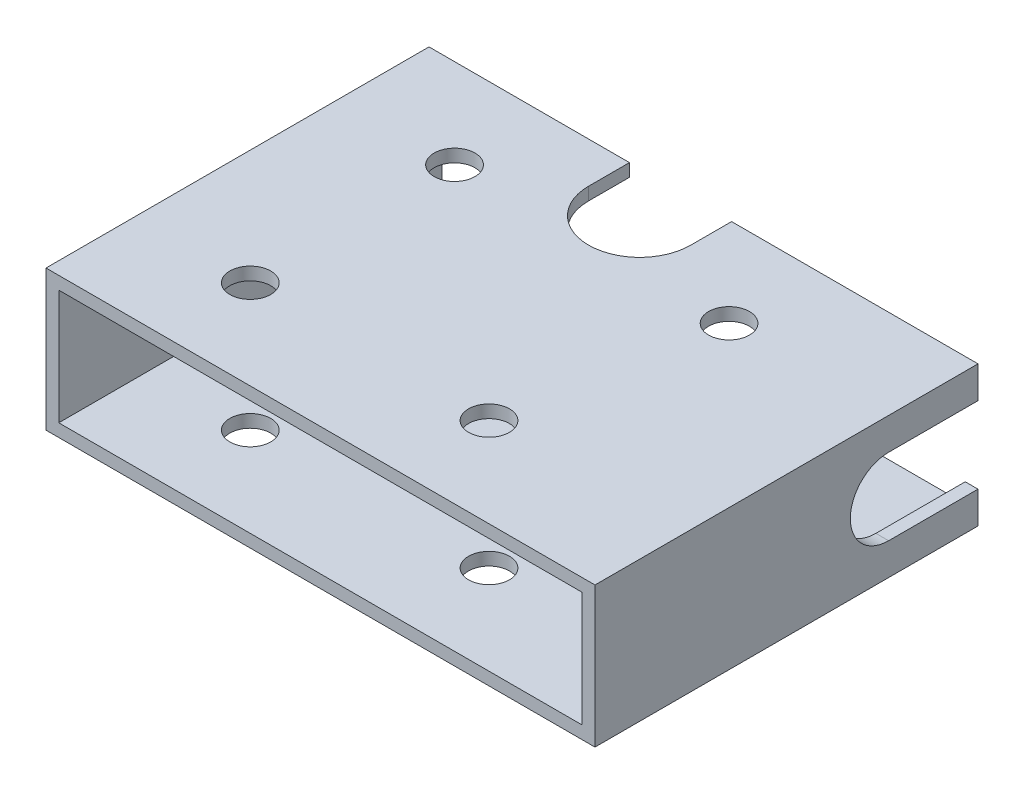
ISO-10303-21;
HEADER;
FILE_DESCRIPTION(('STEP AP214'),'2;1');
FILE_NAME('part.step','',(''),(''),'','','');
FILE_SCHEMA(('AUTOMOTIVE_DESIGN { 1 0 10303 214 1 1 1 1 }'));
ENDSEC;
DATA;
#1=APPLICATION_CONTEXT('core data for automotive mechanical design processes');
#2=APPLICATION_PROTOCOL_DEFINITION('international standard','automotive_design',2000,#1);
#3=PRODUCT_CONTEXT('',#1,'mechanical');
#4=PRODUCT('Part','Part','',(#3));
#5=PRODUCT_RELATED_PRODUCT_CATEGORY('part','',(#4));
#6=PRODUCT_DEFINITION_FORMATION('','',#4);
#7=PRODUCT_DEFINITION_CONTEXT('part definition',#1,'design');
#8=PRODUCT_DEFINITION('design','',#6,#7);
#9=PRODUCT_DEFINITION_SHAPE('','',#8);
#10=(LENGTH_UNIT() NAMED_UNIT(*) SI_UNIT(.MILLI.,.METRE.));
#11=(NAMED_UNIT(*) PLANE_ANGLE_UNIT() SI_UNIT($,.RADIAN.));
#12=(NAMED_UNIT(*) SI_UNIT($,.STERADIAN.) SOLID_ANGLE_UNIT());
#13=UNCERTAINTY_MEASURE_WITH_UNIT(LENGTH_MEASURE(1.E-05),#10,'distance_accuracy_value','');
#14=(GEOMETRIC_REPRESENTATION_CONTEXT(3) GLOBAL_UNCERTAINTY_ASSIGNED_CONTEXT((#13)) GLOBAL_UNIT_ASSIGNED_CONTEXT((#10,
#11,#12)) REPRESENTATION_CONTEXT('',''));
#15=CARTESIAN_POINT('',(0.,0.,0.));
#16=DIRECTION('',(0.,0.,1.));
#17=DIRECTION('',(1.,0.,0.));
#18=AXIS2_PLACEMENT_3D('',#15,#16,#17);
#19=CARTESIAN_POINT('',(0.,0.,0.));
#20=DIRECTION('',(0.,0.,-1.));
#21=DIRECTION('',(-1.,0.,0.));
#22=AXIS2_PLACEMENT_3D('',#19,#20,#21);
#23=PLANE('',#22);
#24=DIRECTION('',(1.,0.,0.));
#25=VECTOR('',#24,1.);
#26=CARTESIAN_POINT('',(-3.,8.5,0.));
#27=LINE('',#26,#25);
#28=CARTESIAN_POINT('',(-1.,8.5,0.));
#29=VERTEX_POINT('',#28);
#30=CARTESIAN_POINT('',(0.,8.5,0.));
#31=VERTEX_POINT('',#30);
#32=EDGE_CURVE('E206',#29,#31,#27,.T.);
#33=ORIENTED_EDGE('',*,*,#32,.F.);
#34=DIRECTION('',(0.,1.,0.));
#35=VECTOR('',#34,1.);
#36=CARTESIAN_POINT('',(-1.,0.999999999999997,0.));
#37=LINE('',#36,#35);
#38=CARTESIAN_POINT('',(-1.,10.,0.));
#39=VERTEX_POINT('',#38);
#40=EDGE_CURVE('E321',#29,#39,#37,.T.);
#41=ORIENTED_EDGE('',*,*,#40,.T.);
#42=DIRECTION('',(-1.,0.,0.));
#43=VECTOR('',#42,1.);
#44=CARTESIAN_POINT('',(-1.,10.,0.));
#45=LINE('',#44,#43);
#46=CARTESIAN_POINT('',(-19.3,10.,0.));
#47=VERTEX_POINT('',#46);
#48=EDGE_CURVE('E342',#39,#47,#45,.T.);
#49=ORIENTED_EDGE('',*,*,#48,.T.);
#50=DIRECTION('',(0.,1.,0.));
#51=VECTOR('',#50,1.);
#52=CARTESIAN_POINT('',(-19.3,8.,0.));
#53=LINE('',#52,#51);
#54=CARTESIAN_POINT('',(-19.3,11.,0.));
#55=VERTEX_POINT('',#54);
#56=EDGE_CURVE('E257',#47,#55,#53,.T.);
#57=ORIENTED_EDGE('',*,*,#56,.T.);
#58=DIRECTION('',(-1.,0.,0.));
#59=VECTOR('',#58,1.);
#60=CARTESIAN_POINT('',(-43.,11.,0.));
#61=LINE('',#60,#59);
#62=CARTESIAN_POINT('',(0.,11.,0.));
#63=VERTEX_POINT('',#62);
#64=EDGE_CURVE('E386',#63,#55,#61,.T.);
#65=ORIENTED_EDGE('',*,*,#64,.F.);
#66=DIRECTION('',(0.,1.,0.));
#67=VECTOR('',#66,1.);
#68=CARTESIAN_POINT('',(0.,11.,0.));
#69=LINE('',#68,#67);
#70=EDGE_CURVE('E368',#31,#63,#69,.T.);
#71=ORIENTED_EDGE('',*,*,#70,.F.);
#72=EDGE_LOOP('',(#33,#41,#49,#57,#65,#71));
#73=FACE_BOUND('',#72,.T.);
#74=ADVANCED_FACE('F38',(#73),#23,.T.);
#75=DIRECTION('',(0.,1.,0.));
#76=VECTOR('',#75,1.);
#77=CARTESIAN_POINT('',(-28.3,-2.,0.));
#78=LINE('',#77,#76);
#79=CARTESIAN_POINT('',(-28.3,0.,0.));
#80=VERTEX_POINT('',#79);
#81=CARTESIAN_POINT('',(-28.3,0.999999999999996,0.));
#82=VERTEX_POINT('',#81);
#83=EDGE_CURVE('E225',#80,#82,#78,.T.);
#84=ORIENTED_EDGE('',*,*,#83,.F.);
#85=DIRECTION('',(1.,0.,0.));
#86=VECTOR('',#85,1.);
#87=CARTESIAN_POINT('',(0.,0.,0.));
#88=LINE('',#87,#86);
#89=CARTESIAN_POINT('',(-43.,0.,0.));
#90=VERTEX_POINT('',#89);
#91=EDGE_CURVE('E373',#90,#80,#88,.T.);
#92=ORIENTED_EDGE('',*,*,#91,.F.);
#93=DIRECTION('',(0.,-1.,0.));
#94=VECTOR('',#93,1.);
#95=CARTESIAN_POINT('',(-43.,0.,0.));
#96=LINE('',#95,#94);
#97=CARTESIAN_POINT('',(-43.,11.,0.));
#98=VERTEX_POINT('',#97);
#99=EDGE_CURVE('E390',#98,#90,#96,.T.);
#100=ORIENTED_EDGE('',*,*,#99,.F.);
#101=CARTESIAN_POINT('',(-27.3,11.,0.));
#102=VERTEX_POINT('',#101);
#103=EDGE_CURVE('E385',#102,#98,#61,.T.);
#104=ORIENTED_EDGE('',*,*,#103,.F.);
#105=DIRECTION('',(0.,1.,0.));
#106=VECTOR('',#105,1.);
#107=CARTESIAN_POINT('',(-27.3,7.99999999999999,0.));
#108=LINE('',#107,#106);
#109=CARTESIAN_POINT('',(-27.3,10.,0.));
#110=VERTEX_POINT('',#109);
#111=EDGE_CURVE('E256',#110,#102,#108,.T.);
#112=ORIENTED_EDGE('',*,*,#111,.F.);
#113=CARTESIAN_POINT('',(-42.,9.99999999999999,0.));
#114=VERTEX_POINT('',#113);
#115=EDGE_CURVE('E341',#110,#114,#45,.T.);
#116=ORIENTED_EDGE('',*,*,#115,.T.);
#117=DIRECTION('',(0.,-1.,0.));
#118=VECTOR('',#117,1.);
#119=CARTESIAN_POINT('',(-42.,9.99999999999999,0.));
#120=LINE('',#119,#118);
#121=CARTESIAN_POINT('',(-42.,0.999999999999995,0.));
#122=VERTEX_POINT('',#121);
#123=EDGE_CURVE('E346',#114,#122,#120,.T.);
#124=ORIENTED_EDGE('',*,*,#123,.T.);
#125=DIRECTION('',(1.,0.,0.));
#126=VECTOR('',#125,1.);
#127=CARTESIAN_POINT('',(-42.,0.999999999999995,0.));
#128=LINE('',#127,#126);
#129=EDGE_CURVE('E326',#122,#82,#128,.T.);
#130=ORIENTED_EDGE('',*,*,#129,.T.);
#131=EDGE_LOOP('',(#84,#92,#100,#104,#112,#116,#124,#130));
#132=FACE_BOUND('',#131,.T.);
#133=ADVANCED_FACE('F472',(#132),#23,.T.);
#134=CARTESIAN_POINT('',(0.,0.,30.));
#135=DIRECTION('',(0.,0.,-1.));
#136=DIRECTION('',(-1.,0.,0.));
#137=AXIS2_PLACEMENT_3D('',#134,#135,#136);
#138=PLANE('',#137);
#139=DIRECTION('',(0.,1.,0.));
#140=VECTOR('',#139,1.);
#141=CARTESIAN_POINT('',(0.,1.,30.));
#142=LINE('',#141,#140);
#143=CARTESIAN_POINT('',(0.,0.,30.));
#144=VERTEX_POINT('',#143);
#145=CARTESIAN_POINT('',(0.,11.,30.));
#146=VERTEX_POINT('',#145);
#147=EDGE_CURVE('E369',#144,#146,#142,.T.);
#148=ORIENTED_EDGE('',*,*,#147,.T.);
#149=DIRECTION('',(-1.,0.,0.));
#150=VECTOR('',#149,1.);
#151=CARTESIAN_POINT('',(-43.,11.,30.));
#152=LINE('',#151,#150);
#153=CARTESIAN_POINT('',(-43.,11.,30.));
#154=VERTEX_POINT('',#153);
#155=EDGE_CURVE('E372',#146,#154,#152,.T.);
#156=ORIENTED_EDGE('',*,*,#155,.T.);
#157=DIRECTION('',(0.,-1.,0.));
#158=VECTOR('',#157,1.);
#159=CARTESIAN_POINT('',(-43.,0.,30.));
#160=LINE('',#159,#158);
#161=CARTESIAN_POINT('',(-43.,0.,30.));
#162=VERTEX_POINT('',#161);
#163=EDGE_CURVE('E376',#154,#162,#160,.T.);
#164=ORIENTED_EDGE('',*,*,#163,.T.);
#165=DIRECTION('',(1.,0.,0.));
#166=VECTOR('',#165,1.);
#167=CARTESIAN_POINT('',(0.,0.,30.));
#168=LINE('',#167,#166);
#169=EDGE_CURVE('E379',#162,#144,#168,.T.);
#170=ORIENTED_EDGE('',*,*,#169,.T.);
#171=EDGE_LOOP('',(#148,#156,#164,#170));
#172=FACE_BOUND('',#171,.T.);
#173=DIRECTION('',(0.,1.,0.));
#174=VECTOR('',#173,1.);
#175=CARTESIAN_POINT('',(-1.,0.999999999999997,30.));
#176=LINE('',#175,#174);
#177=CARTESIAN_POINT('',(-1.,0.999999999999997,30.));
#178=VERTEX_POINT('',#177);
#179=CARTESIAN_POINT('',(-1.,10.,30.));
#180=VERTEX_POINT('',#179);
#181=EDGE_CURVE('E322',#178,#180,#176,.T.);
#182=ORIENTED_EDGE('',*,*,#181,.F.);
#183=DIRECTION('',(1.,0.,0.));
#184=VECTOR('',#183,1.);
#185=CARTESIAN_POINT('',(-42.,0.999999999999995,30.));
#186=LINE('',#185,#184);
#187=CARTESIAN_POINT('',(-42.,0.999999999999995,30.));
#188=VERTEX_POINT('',#187);
#189=EDGE_CURVE('E333',#188,#178,#186,.T.);
#190=ORIENTED_EDGE('',*,*,#189,.F.);
#191=DIRECTION('',(0.,-1.,0.));
#192=VECTOR('',#191,1.);
#193=CARTESIAN_POINT('',(-42.,9.99999999999999,30.));
#194=LINE('',#193,#192);
#195=CARTESIAN_POINT('',(-42.,9.99999999999999,30.));
#196=VERTEX_POINT('',#195);
#197=EDGE_CURVE('E329',#196,#188,#194,.T.);
#198=ORIENTED_EDGE('',*,*,#197,.F.);
#199=DIRECTION('',(-1.,0.,0.));
#200=VECTOR('',#199,1.);
#201=CARTESIAN_POINT('',(-1.,10.,30.));
#202=LINE('',#201,#200);
#203=EDGE_CURVE('E325',#180,#196,#202,.T.);
#204=ORIENTED_EDGE('',*,*,#203,.F.);
#205=EDGE_LOOP('',(#182,#190,#198,#204));
#206=FACE_BOUND('',#205,.T.);
#207=ADVANCED_FACE('F462',(#172,#206),#138,.F.);
#208=DIRECTION('',(1.,0.,0.));
#209=VECTOR('',#208,1.);
#210=CARTESIAN_POINT('',(-3.,2.49999999999999,0.));
#211=LINE('',#210,#209);
#212=CARTESIAN_POINT('',(-1.,2.49999999999999,0.));
#213=VERTEX_POINT('',#212);
#214=CARTESIAN_POINT('',(0.,2.49999999999999,0.));
#215=VERTEX_POINT('',#214);
#216=EDGE_CURVE('E54',#213,#215,#211,.T.);
#217=ORIENTED_EDGE('',*,*,#216,.T.);
#218=CARTESIAN_POINT('',(0.,0.,0.));
#219=VERTEX_POINT('',#218);
#220=EDGE_CURVE('E198',#219,#215,#69,.T.);
#221=ORIENTED_EDGE('',*,*,#220,.F.);
#222=CARTESIAN_POINT('',(-18.3,0.,0.));
#223=VERTEX_POINT('',#222);
#224=EDGE_CURVE('E393',#223,#219,#88,.T.);
#225=ORIENTED_EDGE('',*,*,#224,.F.);
#226=DIRECTION('',(0.,1.,0.));
#227=VECTOR('',#226,1.);
#228=CARTESIAN_POINT('',(-18.3,-2.,0.));
#229=LINE('',#228,#227);
#230=CARTESIAN_POINT('',(-18.3,0.999999999999996,0.));
#231=VERTEX_POINT('',#230);
#232=EDGE_CURVE('E228',#223,#231,#229,.T.);
#233=ORIENTED_EDGE('',*,*,#232,.T.);
#234=CARTESIAN_POINT('',(-1.,0.999999999999997,0.));
#235=VERTEX_POINT('',#234);
#236=EDGE_CURVE('E350',#231,#235,#128,.T.);
#237=ORIENTED_EDGE('',*,*,#236,.T.);
#238=EDGE_CURVE('E337',#235,#213,#37,.T.);
#239=ORIENTED_EDGE('',*,*,#238,.T.);
#240=EDGE_LOOP('',(#217,#221,#225,#233,#237,#239));
#241=FACE_BOUND('',#240,.T.);
#242=ADVANCED_FACE('F458',(#241),#23,.T.);
#243=CARTESIAN_POINT('',(0.,11.,30.));
#244=DIRECTION('',(-1.,0.,0.));
#245=DIRECTION('',(0.,-1.,0.));
#246=AXIS2_PLACEMENT_3D('',#243,#244,#245);
#247=PLANE('',#246);
#248=CARTESIAN_POINT('',(0.,5.5,7.));
#249=DIRECTION('',(1.,0.,0.));
#250=DIRECTION('',(0.,1.,0.));
#251=AXIS2_PLACEMENT_3D('',#248,#249,#250);
#252=CIRCLE('',#251,3.);
#253=CARTESIAN_POINT('',(0.,8.5,7.));
#254=VERTEX_POINT('',#253);
#255=CARTESIAN_POINT('',(0.,2.5,7.));
#256=VERTEX_POINT('',#255);
#257=EDGE_CURVE('E186',#254,#256,#252,.T.);
#258=ORIENTED_EDGE('',*,*,#257,.F.);
#259=DIRECTION('',(0.,0.,1.));
#260=VECTOR('',#259,1.);
#261=CARTESIAN_POINT('',(0.,8.5,7.));
#262=LINE('',#261,#260);
#263=EDGE_CURVE('E183',#31,#254,#262,.T.);
#264=ORIENTED_EDGE('',*,*,#263,.F.);
#265=ORIENTED_EDGE('',*,*,#70,.T.);
#266=DIRECTION('',(0.,0.,-1.));
#267=VECTOR('',#266,1.);
#268=CARTESIAN_POINT('',(0.,11.,30.));
#269=LINE('',#268,#267);
#270=EDGE_CURVE('E407',#146,#63,#269,.T.);
#271=ORIENTED_EDGE('',*,*,#270,.F.);
#272=ORIENTED_EDGE('',*,*,#147,.F.);
#273=DIRECTION('',(0.,0.,-1.));
#274=VECTOR('',#273,1.);
#275=CARTESIAN_POINT('',(0.,0.,30.));
#276=LINE('',#275,#274);
#277=EDGE_CURVE('E382',#144,#219,#276,.T.);
#278=ORIENTED_EDGE('',*,*,#277,.T.);
#279=ORIENTED_EDGE('',*,*,#220,.T.);
#280=DIRECTION('',(0.,0.,-1.));
#281=VECTOR('',#280,1.);
#282=CARTESIAN_POINT('',(0.,2.5,7.));
#283=LINE('',#282,#281);
#284=EDGE_CURVE('E178',#256,#215,#283,.T.);
#285=ORIENTED_EDGE('',*,*,#284,.F.);
#286=EDGE_LOOP('',(#258,#264,#265,#271,#272,#278,#279,#285));
#287=FACE_BOUND('',#286,.T.);
#288=ADVANCED_FACE('F40',(#287),#247,.F.);
#289=CARTESIAN_POINT('',(-43.,11.,30.));
#290=DIRECTION('',(0.,-1.,0.));
#291=DIRECTION('',(1.,0.,0.));
#292=AXIS2_PLACEMENT_3D('',#289,#290,#291);
#293=PLANE('',#292);
#294=CARTESIAN_POINT('',(-12.5,11.,7.));
#295=DIRECTION('',(0.,1.,0.));
#296=DIRECTION('',(0.,0.,-1.));
#297=AXIS2_PLACEMENT_3D('',#294,#295,#296);
#298=CIRCLE('',#297,1.6);
#299=CARTESIAN_POINT('',(-12.5,11.,5.4));
#300=VERTEX_POINT('',#299);
#301=EDGE_CURVE('E261',#300,#300,#298,.T.);
#302=ORIENTED_EDGE('',*,*,#301,.F.);
#303=EDGE_LOOP('',(#302));
#304=FACE_BOUND('',#303,.T.);
#305=CARTESIAN_POINT('',(-15.3,11.,23.));
#306=DIRECTION('',(0.,1.,0.));
#307=DIRECTION('',(0.,0.,1.));
#308=AXIS2_PLACEMENT_3D('',#305,#306,#307);
#309=CIRCLE('',#308,1.6);
#310=CARTESIAN_POINT('',(-15.3,11.,24.6));
#311=VERTEX_POINT('',#310);
#312=EDGE_CURVE('E283',#311,#311,#309,.T.);
#313=ORIENTED_EDGE('',*,*,#312,.F.);
#314=EDGE_LOOP('',(#313));
#315=FACE_BOUND('',#314,.T.);
#316=CARTESIAN_POINT('',(-34.,11.,23.));
#317=DIRECTION('',(0.,1.,0.));
#318=DIRECTION('',(0.,0.,1.));
#319=AXIS2_PLACEMENT_3D('',#316,#317,#318);
#320=CIRCLE('',#319,1.6);
#321=CARTESIAN_POINT('',(-34.,11.,24.6));
#322=VERTEX_POINT('',#321);
#323=EDGE_CURVE('E275',#322,#322,#320,.T.);
#324=ORIENTED_EDGE('',*,*,#323,.F.);
#325=EDGE_LOOP('',(#324));
#326=FACE_BOUND('',#325,.T.);
#327=CARTESIAN_POINT('',(-34.,11.,7.));
#328=DIRECTION('',(0.,1.,0.));
#329=DIRECTION('',(0.,0.,1.));
#330=AXIS2_PLACEMENT_3D('',#327,#328,#329);
#331=CIRCLE('',#330,1.60000000000001);
#332=CARTESIAN_POINT('',(-34.,11.,8.6));
#333=VERTEX_POINT('',#332);
#334=EDGE_CURVE('E274',#333,#333,#331,.T.);
#335=ORIENTED_EDGE('',*,*,#334,.F.);
#336=EDGE_LOOP('',(#335));
#337=FACE_BOUND('',#336,.T.);
#338=ORIENTED_EDGE('',*,*,#64,.T.);
#339=DIRECTION('',(0.,0.,-1.));
#340=VECTOR('',#339,1.);
#341=CARTESIAN_POINT('',(-19.3,11.,0.));
#342=LINE('',#341,#340);
#343=CARTESIAN_POINT('',(-19.3,11.,3.2));
#344=VERTEX_POINT('',#343);
#345=EDGE_CURVE('E253',#344,#55,#342,.T.);
#346=ORIENTED_EDGE('',*,*,#345,.F.);
#347=CARTESIAN_POINT('',(-23.3,11.,3.2));
#348=DIRECTION('',(0.,1.,0.));
#349=DIRECTION('',(1.,0.,0.));
#350=AXIS2_PLACEMENT_3D('',#347,#348,#349);
#351=CIRCLE('',#350,4.);
#352=CARTESIAN_POINT('',(-27.3,11.,3.2));
#353=VERTEX_POINT('',#352);
#354=EDGE_CURVE('E249',#353,#344,#351,.T.);
#355=ORIENTED_EDGE('',*,*,#354,.F.);
#356=DIRECTION('',(0.,0.,1.));
#357=VECTOR('',#356,1.);
#358=CARTESIAN_POINT('',(-27.3,11.,0.));
#359=LINE('',#358,#357);
#360=EDGE_CURVE('E245',#102,#353,#359,.T.);
#361=ORIENTED_EDGE('',*,*,#360,.F.);
#362=ORIENTED_EDGE('',*,*,#103,.T.);
#363=DIRECTION('',(0.,0.,-1.));
#364=VECTOR('',#363,1.);
#365=CARTESIAN_POINT('',(-43.,11.,30.));
#366=LINE('',#365,#364);
#367=EDGE_CURVE('E403',#154,#98,#366,.T.);
#368=ORIENTED_EDGE('',*,*,#367,.F.);
#369=ORIENTED_EDGE('',*,*,#155,.F.);
#370=ORIENTED_EDGE('',*,*,#270,.T.);
#371=EDGE_LOOP('',(#338,#346,#355,#361,#362,#368,#369,#370));
#372=FACE_BOUND('',#371,.T.);
#373=ADVANCED_FACE('F503',(#304,#315,#326,#337,#372),#293,.F.);
#374=CARTESIAN_POINT('',(-43.,0.,30.));
#375=DIRECTION('',(1.,0.,0.));
#376=DIRECTION('',(0.,0.,-1.));
#377=AXIS2_PLACEMENT_3D('',#374,#375,#376);
#378=PLANE('',#377);
#379=ORIENTED_EDGE('',*,*,#99,.T.);
#380=DIRECTION('',(0.,0.,-1.));
#381=VECTOR('',#380,1.);
#382=CARTESIAN_POINT('',(-43.,0.,30.));
#383=LINE('',#382,#381);
#384=EDGE_CURVE('E399',#162,#90,#383,.T.);
#385=ORIENTED_EDGE('',*,*,#384,.F.);
#386=ORIENTED_EDGE('',*,*,#163,.F.);
#387=ORIENTED_EDGE('',*,*,#367,.T.);
#388=EDGE_LOOP('',(#379,#385,#386,#387));
#389=FACE_BOUND('',#388,.T.);
#390=ADVANCED_FACE('F506',(#389),#378,.F.);
#391=CARTESIAN_POINT('',(0.,0.,30.));
#392=DIRECTION('',(0.,1.,0.));
#393=DIRECTION('',(-1.,0.,0.));
#394=AXIS2_PLACEMENT_3D('',#391,#392,#393);
#395=PLANE('',#394);
#396=CARTESIAN_POINT('',(-12.5,0.,7.));
#397=DIRECTION('',(0.,1.,0.));
#398=DIRECTION('',(0.,0.,-1.));
#399=AXIS2_PLACEMENT_3D('',#396,#397,#398);
#400=CIRCLE('',#399,1.6);
#401=CARTESIAN_POINT('',(-12.5,0.,5.4));
#402=VERTEX_POINT('',#401);
#403=EDGE_CURVE('E287',#402,#402,#400,.T.);
#404=ORIENTED_EDGE('',*,*,#403,.T.);
#405=EDGE_LOOP('',(#404));
#406=FACE_BOUND('',#405,.T.);
#407=CARTESIAN_POINT('',(-15.3,0.,23.));
#408=DIRECTION('',(0.,1.,0.));
#409=DIRECTION('',(0.,0.,1.));
#410=AXIS2_PLACEMENT_3D('',#407,#408,#409);
#411=CIRCLE('',#410,1.6);
#412=CARTESIAN_POINT('',(-15.3,0.,24.6));
#413=VERTEX_POINT('',#412);
#414=EDGE_CURVE('E279',#413,#413,#411,.T.);
#415=ORIENTED_EDGE('',*,*,#414,.T.);
#416=EDGE_LOOP('',(#415));
#417=FACE_BOUND('',#416,.T.);
#418=CARTESIAN_POINT('',(-34.,0.,23.));
#419=DIRECTION('',(0.,1.,0.));
#420=DIRECTION('',(0.,0.,1.));
#421=AXIS2_PLACEMENT_3D('',#418,#419,#420);
#422=CIRCLE('',#421,1.6);
#423=CARTESIAN_POINT('',(-34.,0.,24.6));
#424=VERTEX_POINT('',#423);
#425=EDGE_CURVE('E270',#424,#424,#422,.T.);
#426=ORIENTED_EDGE('',*,*,#425,.T.);
#427=EDGE_LOOP('',(#426));
#428=FACE_BOUND('',#427,.T.);
#429=CARTESIAN_POINT('',(-34.,0.,7.));
#430=DIRECTION('',(0.,1.,0.));
#431=DIRECTION('',(0.,0.,1.));
#432=AXIS2_PLACEMENT_3D('',#429,#430,#431);
#433=CIRCLE('',#432,1.60000000000001);
#434=CARTESIAN_POINT('',(-34.,0.,8.6));
#435=VERTEX_POINT('',#434);
#436=EDGE_CURVE('E294',#435,#435,#433,.T.);
#437=ORIENTED_EDGE('',*,*,#436,.T.);
#438=EDGE_LOOP('',(#437));
#439=FACE_BOUND('',#438,.T.);
#440=ORIENTED_EDGE('',*,*,#91,.T.);
#441=DIRECTION('',(0.,0.,1.));
#442=VECTOR('',#441,1.);
#443=CARTESIAN_POINT('',(-28.3,0.,30.));
#444=LINE('',#443,#442);
#445=CARTESIAN_POINT('',(-28.3,0.,3.2));
#446=VERTEX_POINT('',#445);
#447=EDGE_CURVE('E237',#80,#446,#444,.T.);
#448=ORIENTED_EDGE('',*,*,#447,.T.);
#449=CARTESIAN_POINT('',(-23.3,0.,3.2));
#450=DIRECTION('',(0.,1.,0.));
#451=DIRECTION('',(-1.,0.,0.));
#452=AXIS2_PLACEMENT_3D('',#449,#450,#451);
#453=CIRCLE('',#452,5.);
#454=CARTESIAN_POINT('',(-18.3,0.,3.2));
#455=VERTEX_POINT('',#454);
#456=EDGE_CURVE('E241',#446,#455,#453,.T.);
#457=ORIENTED_EDGE('',*,*,#456,.T.);
#458=DIRECTION('',(0.,0.,-1.));
#459=VECTOR('',#458,1.);
#460=CARTESIAN_POINT('',(-18.3,0.,30.));
#461=LINE('',#460,#459);
#462=EDGE_CURVE('E224',#455,#223,#461,.T.);
#463=ORIENTED_EDGE('',*,*,#462,.T.);
#464=ORIENTED_EDGE('',*,*,#224,.T.);
#465=ORIENTED_EDGE('',*,*,#277,.F.);
#466=ORIENTED_EDGE('',*,*,#169,.F.);
#467=ORIENTED_EDGE('',*,*,#384,.T.);
#468=EDGE_LOOP('',(#440,#448,#457,#463,#464,#465,#466,#467));
#469=FACE_BOUND('',#468,.T.);
#470=ADVANCED_FACE('F454',(#406,#417,#428,#439,#469),#395,.F.);
#471=CARTESIAN_POINT('',(-1.,0.999999999999997,30.));
#472=DIRECTION('',(-1.,0.,0.));
#473=DIRECTION('',(0.,-1.,0.));
#474=AXIS2_PLACEMENT_3D('',#471,#472,#473);
#475=PLANE('',#474);
#476=DIRECTION('',(0.,0.,-1.));
#477=VECTOR('',#476,1.);
#478=CARTESIAN_POINT('',(-1.,8.5,30.));
#479=LINE('',#478,#477);
#480=CARTESIAN_POINT('',(-1.,8.5,7.));
#481=VERTEX_POINT('',#480);
#482=EDGE_CURVE('E11',#481,#29,#479,.T.);
#483=ORIENTED_EDGE('',*,*,#482,.F.);
#484=CARTESIAN_POINT('',(-1.,5.5,7.));
#485=DIRECTION('',(-1.,0.,0.));
#486=DIRECTION('',(0.,-1.,0.));
#487=AXIS2_PLACEMENT_3D('',#484,#485,#486);
#488=CIRCLE('',#487,3.);
#489=CARTESIAN_POINT('',(-1.,2.5,7.));
#490=VERTEX_POINT('',#489);
#491=EDGE_CURVE('E47',#490,#481,#488,.T.);
#492=ORIENTED_EDGE('',*,*,#491,.F.);
#493=DIRECTION('',(0.,0.,1.));
#494=VECTOR('',#493,1.);
#495=CARTESIAN_POINT('',(-1.,2.50000000000002,30.));
#496=LINE('',#495,#494);
#497=EDGE_CURVE('E179',#213,#490,#496,.T.);
#498=ORIENTED_EDGE('',*,*,#497,.F.);
#499=ORIENTED_EDGE('',*,*,#238,.F.);
#500=DIRECTION('',(0.,0.,-1.));
#501=VECTOR('',#500,1.);
#502=CARTESIAN_POINT('',(-1.,0.999999999999997,30.));
#503=LINE('',#502,#501);
#504=EDGE_CURVE('E336',#178,#235,#503,.T.);
#505=ORIENTED_EDGE('',*,*,#504,.F.);
#506=ORIENTED_EDGE('',*,*,#181,.T.);
#507=DIRECTION('',(0.,0.,-1.));
#508=VECTOR('',#507,1.);
#509=CARTESIAN_POINT('',(-1.,10.,30.));
#510=LINE('',#509,#508);
#511=EDGE_CURVE('E364',#180,#39,#510,.T.);
#512=ORIENTED_EDGE('',*,*,#511,.T.);
#513=ORIENTED_EDGE('',*,*,#40,.F.);
#514=EDGE_LOOP('',(#483,#492,#498,#499,#505,#506,#512,#513));
#515=FACE_BOUND('',#514,.T.);
#516=ADVANCED_FACE('F441',(#515),#475,.T.);
#517=CARTESIAN_POINT('',(-1.,10.,30.));
#518=DIRECTION('',(0.,-1.,0.));
#519=DIRECTION('',(1.,0.,0.));
#520=AXIS2_PLACEMENT_3D('',#517,#518,#519);
#521=PLANE('',#520);
#522=DIRECTION('',(0.,0.,1.));
#523=VECTOR('',#522,1.);
#524=CARTESIAN_POINT('',(-19.3,10.,30.));
#525=LINE('',#524,#523);
#526=CARTESIAN_POINT('',(-19.3,10.,3.2));
#527=VERTEX_POINT('',#526);
#528=EDGE_CURVE('E430',#47,#527,#525,.T.);
#529=ORIENTED_EDGE('',*,*,#528,.F.);
#530=ORIENTED_EDGE('',*,*,#48,.F.);
#531=ORIENTED_EDGE('',*,*,#511,.F.);
#532=ORIENTED_EDGE('',*,*,#203,.T.);
#533=DIRECTION('',(0.,0.,-1.));
#534=VECTOR('',#533,1.);
#535=CARTESIAN_POINT('',(-42.,9.99999999999999,30.));
#536=LINE('',#535,#534);
#537=EDGE_CURVE('E360',#196,#114,#536,.T.);
#538=ORIENTED_EDGE('',*,*,#537,.T.);
#539=ORIENTED_EDGE('',*,*,#115,.F.);
#540=DIRECTION('',(0.,0.,-1.));
#541=VECTOR('',#540,1.);
#542=CARTESIAN_POINT('',(-27.3,10.,30.));
#543=LINE('',#542,#541);
#544=CARTESIAN_POINT('',(-27.3,10.,3.2));
#545=VERTEX_POINT('',#544);
#546=EDGE_CURVE('E411',#545,#110,#543,.T.);
#547=ORIENTED_EDGE('',*,*,#546,.F.);
#548=CARTESIAN_POINT('',(-23.3,10.,3.2));
#549=DIRECTION('',(0.,-1.,0.));
#550=DIRECTION('',(1.,0.,0.));
#551=AXIS2_PLACEMENT_3D('',#548,#549,#550);
#552=CIRCLE('',#551,4.);
#553=EDGE_CURVE('E426',#527,#545,#552,.T.);
#554=ORIENTED_EDGE('',*,*,#553,.F.);
#555=EDGE_LOOP('',(#529,#530,#531,#532,#538,#539,#547,#554));
#556=FACE_BOUND('',#555,.T.);
#557=CARTESIAN_POINT('',(-12.5,10.,7.));
#558=DIRECTION('',(0.,-1.,0.));
#559=DIRECTION('',(1.,0.,0.));
#560=AXIS2_PLACEMENT_3D('',#557,#558,#559);
#561=CIRCLE('',#560,1.6);
#562=CARTESIAN_POINT('',(-10.9,10.,7.));
#563=VERTEX_POINT('',#562);
#564=EDGE_CURVE('E317',#563,#563,#561,.T.);
#565=ORIENTED_EDGE('',*,*,#564,.F.);
#566=EDGE_LOOP('',(#565));
#567=FACE_BOUND('',#566,.T.);
#568=CARTESIAN_POINT('',(-15.3,10.,23.));
#569=DIRECTION('',(0.,-1.,0.));
#570=DIRECTION('',(1.,0.,0.));
#571=AXIS2_PLACEMENT_3D('',#568,#569,#570);
#572=CIRCLE('',#571,1.6);
#573=CARTESIAN_POINT('',(-13.7,10.,23.));
#574=VERTEX_POINT('',#573);
#575=EDGE_CURVE('E312',#574,#574,#572,.T.);
#576=ORIENTED_EDGE('',*,*,#575,.F.);
#577=EDGE_LOOP('',(#576));
#578=FACE_BOUND('',#577,.T.);
#579=CARTESIAN_POINT('',(-34.,9.99999999999999,23.));
#580=DIRECTION('',(0.,-1.,0.));
#581=DIRECTION('',(1.,0.,0.));
#582=AXIS2_PLACEMENT_3D('',#579,#580,#581);
#583=CIRCLE('',#582,1.6);
#584=CARTESIAN_POINT('',(-32.4,9.99999999999999,23.));
#585=VERTEX_POINT('',#584);
#586=EDGE_CURVE('E307',#585,#585,#583,.T.);
#587=ORIENTED_EDGE('',*,*,#586,.F.);
#588=EDGE_LOOP('',(#587));
#589=FACE_BOUND('',#588,.T.);
#590=CARTESIAN_POINT('',(-34.,9.99999999999999,7.));
#591=DIRECTION('',(0.,-1.,0.));
#592=DIRECTION('',(1.,0.,0.));
#593=AXIS2_PLACEMENT_3D('',#590,#591,#592);
#594=CIRCLE('',#593,1.60000000000001);
#595=CARTESIAN_POINT('',(-32.4,9.99999999999999,7.));
#596=VERTEX_POINT('',#595);
#597=EDGE_CURVE('E302',#596,#596,#594,.T.);
#598=ORIENTED_EDGE('',*,*,#597,.F.);
#599=EDGE_LOOP('',(#598));
#600=FACE_BOUND('',#599,.T.);
#601=ADVANCED_FACE('F494',(#556,#567,#578,#589,#600),#521,.T.);
#602=CARTESIAN_POINT('',(-42.,9.99999999999999,30.));
#603=DIRECTION('',(1.,0.,0.));
#604=DIRECTION('',(0.,0.,-1.));
#605=AXIS2_PLACEMENT_3D('',#602,#603,#604);
#606=PLANE('',#605);
#607=ORIENTED_EDGE('',*,*,#123,.F.);
#608=ORIENTED_EDGE('',*,*,#537,.F.);
#609=ORIENTED_EDGE('',*,*,#197,.T.);
#610=DIRECTION('',(0.,0.,-1.));
#611=VECTOR('',#610,1.);
#612=CARTESIAN_POINT('',(-42.,0.999999999999995,30.));
#613=LINE('',#612,#611);
#614=EDGE_CURVE('E357',#188,#122,#613,.T.);
#615=ORIENTED_EDGE('',*,*,#614,.T.);
#616=EDGE_LOOP('',(#607,#608,#609,#615));
#617=FACE_BOUND('',#616,.T.);
#618=ADVANCED_FACE('F537',(#617),#606,.T.);
#619=CARTESIAN_POINT('',(-42.,0.999999999999995,30.));
#620=DIRECTION('',(0.,1.,0.));
#621=DIRECTION('',(-1.,0.,0.));
#622=AXIS2_PLACEMENT_3D('',#619,#620,#621);
#623=PLANE('',#622);
#624=DIRECTION('',(0.,0.,1.));
#625=VECTOR('',#624,1.);
#626=CARTESIAN_POINT('',(-28.3,0.999999999999996,3.2));
#627=LINE('',#626,#625);
#628=CARTESIAN_POINT('',(-28.3,0.999999999999996,3.2));
#629=VERTEX_POINT('',#628);
#630=EDGE_CURVE('E216',#82,#629,#627,.T.);
#631=ORIENTED_EDGE('',*,*,#630,.F.);
#632=ORIENTED_EDGE('',*,*,#129,.F.);
#633=ORIENTED_EDGE('',*,*,#614,.F.);
#634=ORIENTED_EDGE('',*,*,#189,.T.);
#635=ORIENTED_EDGE('',*,*,#504,.T.);
#636=ORIENTED_EDGE('',*,*,#236,.F.);
#637=DIRECTION('',(0.,0.,-1.));
#638=VECTOR('',#637,1.);
#639=CARTESIAN_POINT('',(-18.3,0.999999999999996,0.));
#640=LINE('',#639,#638);
#641=CARTESIAN_POINT('',(-18.3,0.999999999999996,3.2));
#642=VERTEX_POINT('',#641);
#643=EDGE_CURVE('E213',#642,#231,#640,.T.);
#644=ORIENTED_EDGE('',*,*,#643,.F.);
#645=CARTESIAN_POINT('',(-23.3,0.999999999999996,3.2));
#646=DIRECTION('',(0.,1.,0.));
#647=DIRECTION('',(1.,0.,0.));
#648=AXIS2_PLACEMENT_3D('',#645,#646,#647);
#649=CIRCLE('',#648,5.);
#650=EDGE_CURVE('E62',#629,#642,#649,.T.);
#651=ORIENTED_EDGE('',*,*,#650,.F.);
#652=EDGE_LOOP('',(#631,#632,#633,#634,#635,#636,#644,#651));
#653=FACE_BOUND('',#652,.T.);
#654=CARTESIAN_POINT('',(-12.5,0.999999999999996,7.));
#655=DIRECTION('',(0.,1.,0.));
#656=DIRECTION('',(-1.,0.,0.));
#657=AXIS2_PLACEMENT_3D('',#654,#655,#656);
#658=CIRCLE('',#657,1.6);
#659=CARTESIAN_POINT('',(-14.1,0.999999999999996,7.));
#660=VERTEX_POINT('',#659);
#661=EDGE_CURVE('E316',#660,#660,#658,.T.);
#662=ORIENTED_EDGE('',*,*,#661,.F.);
#663=EDGE_LOOP('',(#662));
#664=FACE_BOUND('',#663,.T.);
#665=CARTESIAN_POINT('',(-15.3,0.999999999999996,23.));
#666=DIRECTION('',(0.,1.,0.));
#667=DIRECTION('',(-1.,0.,0.));
#668=AXIS2_PLACEMENT_3D('',#665,#666,#667);
#669=CIRCLE('',#668,1.6);
#670=CARTESIAN_POINT('',(-16.9,0.999999999999996,23.));
#671=VERTEX_POINT('',#670);
#672=EDGE_CURVE('E311',#671,#671,#669,.T.);
#673=ORIENTED_EDGE('',*,*,#672,.F.);
#674=EDGE_LOOP('',(#673));
#675=FACE_BOUND('',#674,.T.);
#676=CARTESIAN_POINT('',(-34.,0.999999999999995,23.));
#677=DIRECTION('',(0.,1.,0.));
#678=DIRECTION('',(-1.,0.,0.));
#679=AXIS2_PLACEMENT_3D('',#676,#677,#678);
#680=CIRCLE('',#679,1.6);
#681=CARTESIAN_POINT('',(-35.6,0.999999999999995,23.));
#682=VERTEX_POINT('',#681);
#683=EDGE_CURVE('E306',#682,#682,#680,.T.);
#684=ORIENTED_EDGE('',*,*,#683,.F.);
#685=EDGE_LOOP('',(#684));
#686=FACE_BOUND('',#685,.T.);
#687=CARTESIAN_POINT('',(-34.,0.999999999999995,7.));
#688=DIRECTION('',(0.,1.,0.));
#689=DIRECTION('',(-1.,0.,0.));
#690=AXIS2_PLACEMENT_3D('',#687,#688,#689);
#691=CIRCLE('',#690,1.60000000000001);
#692=CARTESIAN_POINT('',(-35.6,0.999999999999995,7.));
#693=VERTEX_POINT('',#692);
#694=EDGE_CURVE('E298',#693,#693,#691,.T.);
#695=ORIENTED_EDGE('',*,*,#694,.F.);
#696=EDGE_LOOP('',(#695));
#697=FACE_BOUND('',#696,.T.);
#698=ADVANCED_FACE('F480',(#653,#664,#675,#686,#697),#623,.T.);
#699=CARTESIAN_POINT('',(-34.,0.,7.));
#700=DIRECTION('',(0.,1.,0.));
#701=DIRECTION('',(0.,0.,1.));
#702=AXIS2_PLACEMENT_3D('',#699,#700,#701);
#703=CYLINDRICAL_SURFACE('',#702,1.60000000000001);
#704=ORIENTED_EDGE('',*,*,#694,.T.);
#705=EDGE_LOOP('',(#704));
#706=FACE_BOUND('',#705,.T.);
#707=ORIENTED_EDGE('',*,*,#436,.F.);
#708=EDGE_LOOP('',(#707));
#709=FACE_BOUND('',#708,.T.);
#710=ADVANCED_FACE('F543',(#706,#709),#703,.F.);
#711=CARTESIAN_POINT('',(-34.,0.,23.));
#712=DIRECTION('',(0.,1.,0.));
#713=DIRECTION('',(0.,0.,1.));
#714=AXIS2_PLACEMENT_3D('',#711,#712,#713);
#715=CYLINDRICAL_SURFACE('',#714,1.6);
#716=ORIENTED_EDGE('',*,*,#683,.T.);
#717=EDGE_LOOP('',(#716));
#718=FACE_BOUND('',#717,.T.);
#719=ORIENTED_EDGE('',*,*,#425,.F.);
#720=EDGE_LOOP('',(#719));
#721=FACE_BOUND('',#720,.T.);
#722=ADVANCED_FACE('F546',(#718,#721),#715,.F.);
#723=CARTESIAN_POINT('',(-15.3,0.,23.));
#724=DIRECTION('',(0.,1.,0.));
#725=DIRECTION('',(0.,0.,1.));
#726=AXIS2_PLACEMENT_3D('',#723,#724,#725);
#727=CYLINDRICAL_SURFACE('',#726,1.6);
#728=ORIENTED_EDGE('',*,*,#672,.T.);
#729=EDGE_LOOP('',(#728));
#730=FACE_BOUND('',#729,.T.);
#731=ORIENTED_EDGE('',*,*,#414,.F.);
#732=EDGE_LOOP('',(#731));
#733=FACE_BOUND('',#732,.T.);
#734=ADVANCED_FACE('F552',(#730,#733),#727,.F.);
#735=CARTESIAN_POINT('',(-12.5,0.,7.));
#736=DIRECTION('',(0.,1.,0.));
#737=DIRECTION('',(0.,0.,1.));
#738=AXIS2_PLACEMENT_3D('',#735,#736,#737);
#739=CYLINDRICAL_SURFACE('',#738,1.6);
#740=ORIENTED_EDGE('',*,*,#661,.T.);
#741=EDGE_LOOP('',(#740));
#742=FACE_BOUND('',#741,.T.);
#743=ORIENTED_EDGE('',*,*,#403,.F.);
#744=EDGE_LOOP('',(#743));
#745=FACE_BOUND('',#744,.T.);
#746=ADVANCED_FACE('F549',(#742,#745),#739,.F.);
#747=ORIENTED_EDGE('',*,*,#597,.T.);
#748=EDGE_LOOP('',(#747));
#749=FACE_BOUND('',#748,.T.);
#750=ORIENTED_EDGE('',*,*,#334,.T.);
#751=EDGE_LOOP('',(#750));
#752=FACE_BOUND('',#751,.T.);
#753=ADVANCED_FACE('F548',(#749,#752),#703,.F.);
#754=ORIENTED_EDGE('',*,*,#586,.T.);
#755=EDGE_LOOP('',(#754));
#756=FACE_BOUND('',#755,.T.);
#757=ORIENTED_EDGE('',*,*,#323,.T.);
#758=EDGE_LOOP('',(#757));
#759=FACE_BOUND('',#758,.T.);
#760=ADVANCED_FACE('F562',(#756,#759),#715,.F.);
#761=ORIENTED_EDGE('',*,*,#575,.T.);
#762=EDGE_LOOP('',(#761));
#763=FACE_BOUND('',#762,.T.);
#764=ORIENTED_EDGE('',*,*,#312,.T.);
#765=EDGE_LOOP('',(#764));
#766=FACE_BOUND('',#765,.T.);
#767=ADVANCED_FACE('F558',(#763,#766),#727,.F.);
#768=ORIENTED_EDGE('',*,*,#564,.T.);
#769=EDGE_LOOP('',(#768));
#770=FACE_BOUND('',#769,.T.);
#771=ORIENTED_EDGE('',*,*,#301,.T.);
#772=EDGE_LOOP('',(#771));
#773=FACE_BOUND('',#772,.T.);
#774=ADVANCED_FACE('F554',(#770,#773),#739,.F.);
#775=CARTESIAN_POINT('',(-19.3,8.,0.));
#776=DIRECTION('',(1.,0.,0.));
#777=DIRECTION('',(0.,1.,0.));
#778=AXIS2_PLACEMENT_3D('',#775,#776,#777);
#779=PLANE('',#778);
#780=ORIENTED_EDGE('',*,*,#528,.T.);
#781=DIRECTION('',(0.,1.,0.));
#782=VECTOR('',#781,1.);
#783=CARTESIAN_POINT('',(-19.3,8.,3.2));
#784=LINE('',#783,#782);
#785=EDGE_CURVE('E262',#527,#344,#784,.T.);
#786=ORIENTED_EDGE('',*,*,#785,.T.);
#787=ORIENTED_EDGE('',*,*,#345,.T.);
#788=ORIENTED_EDGE('',*,*,#56,.F.);
#789=EDGE_LOOP('',(#780,#786,#787,#788));
#790=FACE_BOUND('',#789,.T.);
#791=ADVANCED_FACE('F571',(#790),#779,.F.);
#792=CARTESIAN_POINT('',(-23.3,7.99999999999999,3.2));
#793=DIRECTION('',(0.,1.,0.));
#794=DIRECTION('',(-1.,0.,0.));
#795=AXIS2_PLACEMENT_3D('',#792,#793,#794);
#796=CYLINDRICAL_SURFACE('',#795,4.);
#797=ORIENTED_EDGE('',*,*,#553,.T.);
#798=DIRECTION('',(0.,1.,0.));
#799=VECTOR('',#798,1.);
#800=CARTESIAN_POINT('',(-27.3,7.99999999999999,3.2));
#801=LINE('',#800,#799);
#802=EDGE_CURVE('E265',#545,#353,#801,.T.);
#803=ORIENTED_EDGE('',*,*,#802,.T.);
#804=ORIENTED_EDGE('',*,*,#354,.T.);
#805=ORIENTED_EDGE('',*,*,#785,.F.);
#806=EDGE_LOOP('',(#797,#803,#804,#805));
#807=FACE_BOUND('',#806,.T.);
#808=ADVANCED_FACE('F567',(#807),#796,.F.);
#809=CARTESIAN_POINT('',(-27.3,7.99999999999999,0.));
#810=DIRECTION('',(-1.,0.,0.));
#811=DIRECTION('',(0.,-1.,0.));
#812=AXIS2_PLACEMENT_3D('',#809,#810,#811);
#813=PLANE('',#812);
#814=ORIENTED_EDGE('',*,*,#546,.T.);
#815=ORIENTED_EDGE('',*,*,#111,.T.);
#816=ORIENTED_EDGE('',*,*,#360,.T.);
#817=ORIENTED_EDGE('',*,*,#802,.F.);
#818=EDGE_LOOP('',(#814,#815,#816,#817));
#819=FACE_BOUND('',#818,.T.);
#820=ADVANCED_FACE('F563',(#819),#813,.F.);
#821=CARTESIAN_POINT('',(-23.3,-2.,3.2));
#822=DIRECTION('',(0.,1.,0.));
#823=DIRECTION('',(-1.,0.,0.));
#824=AXIS2_PLACEMENT_3D('',#821,#822,#823);
#825=CYLINDRICAL_SURFACE('',#824,5.);
#826=DIRECTION('',(0.,1.,0.));
#827=VECTOR('',#826,1.);
#828=CARTESIAN_POINT('',(-28.3,-2.,3.2));
#829=LINE('',#828,#827);
#830=EDGE_CURVE('E221',#446,#629,#829,.T.);
#831=ORIENTED_EDGE('',*,*,#830,.T.);
#832=ORIENTED_EDGE('',*,*,#650,.T.);
#833=DIRECTION('',(0.,1.,0.));
#834=VECTOR('',#833,1.);
#835=CARTESIAN_POINT('',(-18.3,-2.,3.2));
#836=LINE('',#835,#834);
#837=EDGE_CURVE('E220',#455,#642,#836,.T.);
#838=ORIENTED_EDGE('',*,*,#837,.F.);
#839=ORIENTED_EDGE('',*,*,#456,.F.);
#840=EDGE_LOOP('',(#831,#832,#838,#839));
#841=FACE_BOUND('',#840,.T.);
#842=ADVANCED_FACE('F566',(#841),#825,.F.);
#843=CARTESIAN_POINT('',(-28.3,-2.,3.2));
#844=DIRECTION('',(-1.,0.,0.));
#845=DIRECTION('',(0.,-1.,0.));
#846=AXIS2_PLACEMENT_3D('',#843,#844,#845);
#847=PLANE('',#846);
#848=ORIENTED_EDGE('',*,*,#83,.T.);
#849=ORIENTED_EDGE('',*,*,#630,.T.);
#850=ORIENTED_EDGE('',*,*,#830,.F.);
#851=ORIENTED_EDGE('',*,*,#447,.F.);
#852=EDGE_LOOP('',(#848,#849,#850,#851));
#853=FACE_BOUND('',#852,.T.);
#854=ADVANCED_FACE('F477',(#853),#847,.F.);
#855=CARTESIAN_POINT('',(-18.3,-2.,0.));
#856=DIRECTION('',(1.,0.,0.));
#857=DIRECTION('',(0.,1.,0.));
#858=AXIS2_PLACEMENT_3D('',#855,#856,#857);
#859=PLANE('',#858);
#860=ORIENTED_EDGE('',*,*,#837,.T.);
#861=ORIENTED_EDGE('',*,*,#643,.T.);
#862=ORIENTED_EDGE('',*,*,#232,.F.);
#863=ORIENTED_EDGE('',*,*,#462,.F.);
#864=EDGE_LOOP('',(#860,#861,#862,#863));
#865=FACE_BOUND('',#864,.T.);
#866=ADVANCED_FACE('F485',(#865),#859,.F.);
#867=CARTESIAN_POINT('',(-3.,5.5,7.));
#868=DIRECTION('',(1.,0.,0.));
#869=DIRECTION('',(0.,1.,0.));
#870=AXIS2_PLACEMENT_3D('',#867,#868,#869);
#871=CYLINDRICAL_SURFACE('',#870,3.);
#872=ORIENTED_EDGE('',*,*,#491,.T.);
#873=DIRECTION('',(1.,0.,0.));
#874=VECTOR('',#873,1.);
#875=CARTESIAN_POINT('',(-3.,8.5,7.));
#876=LINE('',#875,#874);
#877=EDGE_CURVE('E189',#481,#254,#876,.T.);
#878=ORIENTED_EDGE('',*,*,#877,.T.);
#879=ORIENTED_EDGE('',*,*,#257,.T.);
#880=DIRECTION('',(1.,0.,0.));
#881=VECTOR('',#880,1.);
#882=CARTESIAN_POINT('',(-3.,2.5,7.));
#883=LINE('',#882,#881);
#884=EDGE_CURVE('E174',#490,#256,#883,.T.);
#885=ORIENTED_EDGE('',*,*,#884,.F.);
#886=EDGE_LOOP('',(#872,#878,#879,#885));
#887=FACE_BOUND('',#886,.T.);
#888=ADVANCED_FACE('F187',(#887),#871,.F.);
#889=CARTESIAN_POINT('',(-3.,8.5,7.));
#890=DIRECTION('',(0.,1.,0.));
#891=DIRECTION('',(-1.,0.,0.));
#892=AXIS2_PLACEMENT_3D('',#889,#890,#891);
#893=PLANE('',#892);
#894=ORIENTED_EDGE('',*,*,#482,.T.);
#895=ORIENTED_EDGE('',*,*,#32,.T.);
#896=ORIENTED_EDGE('',*,*,#263,.T.);
#897=ORIENTED_EDGE('',*,*,#877,.F.);
#898=EDGE_LOOP('',(#894,#895,#896,#897));
#899=FACE_BOUND('',#898,.T.);
#900=ADVANCED_FACE('F438',(#899),#893,.F.);
#901=CARTESIAN_POINT('',(-3.,2.5,7.));
#902=DIRECTION('',(0.,-1.,0.));
#903=DIRECTION('',(0.,0.,-1.));
#904=AXIS2_PLACEMENT_3D('',#901,#902,#903);
#905=PLANE('',#904);
#906=ORIENTED_EDGE('',*,*,#497,.T.);
#907=ORIENTED_EDGE('',*,*,#884,.T.);
#908=ORIENTED_EDGE('',*,*,#284,.T.);
#909=ORIENTED_EDGE('',*,*,#216,.F.);
#910=EDGE_LOOP('',(#906,#907,#908,#909));
#911=FACE_BOUND('',#910,.T.);
#912=ADVANCED_FACE('F176',(#911),#905,.F.);
#913=CLOSED_SHELL('',(#74,#133,#207,#242,#288,#373,#390,#470,#516,#601,#618,#698,#710,#722,#734,
#746,#753,#760,#767,#774,#791,#808,#820,#842,#854,#866,#888,#900,#912));
#914=MANIFOLD_SOLID_BREP('B2',#913);
#915=ADVANCED_BREP_SHAPE_REPRESENTATION('',(#18,#914),#14);
#916=SHAPE_DEFINITION_REPRESENTATION(#9,#915);
ENDSEC;
END-ISO-10303-21;
